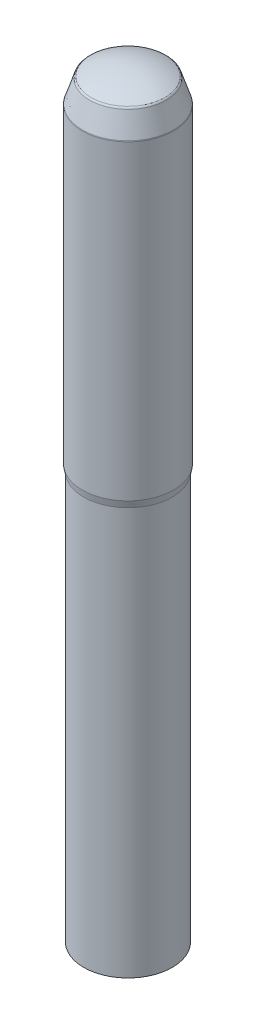
ISO-10303-21;
HEADER;
FILE_DESCRIPTION(('STEP AP214'),'2;1');
FILE_NAME('part.step','',(''),(''),'','','');
FILE_SCHEMA(('AUTOMOTIVE_DESIGN { 1 0 10303 214 1 1 1 1 }'));
ENDSEC;
DATA;
#1=APPLICATION_CONTEXT('core data for automotive mechanical design processes');
#2=APPLICATION_PROTOCOL_DEFINITION('international standard','automotive_design',2000,#1);
#3=PRODUCT_CONTEXT('',#1,'mechanical');
#4=PRODUCT('Part','Part','',(#3));
#5=PRODUCT_RELATED_PRODUCT_CATEGORY('part','',(#4));
#6=PRODUCT_DEFINITION_FORMATION('','',#4);
#7=PRODUCT_DEFINITION_CONTEXT('part definition',#1,'design');
#8=PRODUCT_DEFINITION('design','',#6,#7);
#9=PRODUCT_DEFINITION_SHAPE('','',#8);
#10=(LENGTH_UNIT() NAMED_UNIT(*) SI_UNIT(.MILLI.,.METRE.));
#11=(NAMED_UNIT(*) PLANE_ANGLE_UNIT() SI_UNIT($,.RADIAN.));
#12=(NAMED_UNIT(*) SI_UNIT($,.STERADIAN.) SOLID_ANGLE_UNIT());
#13=UNCERTAINTY_MEASURE_WITH_UNIT(LENGTH_MEASURE(1.E-05),#10,'distance_accuracy_value','');
#14=(GEOMETRIC_REPRESENTATION_CONTEXT(3) GLOBAL_UNCERTAINTY_ASSIGNED_CONTEXT((#13)) GLOBAL_UNIT_ASSIGNED_CONTEXT((#10,
#11,#12)) REPRESENTATION_CONTEXT('',''));
#15=CARTESIAN_POINT('',(0.,0.,0.));
#16=DIRECTION('',(0.,0.,1.));
#17=DIRECTION('',(1.,0.,0.));
#18=AXIS2_PLACEMENT_3D('',#15,#16,#17);
#19=CARTESIAN_POINT('',(0.,0.,0.));
#20=DIRECTION('',(0.,-1.,0.));
#21=DIRECTION('',(0.,0.,-1.));
#22=AXIS2_PLACEMENT_3D('',#19,#20,#21);
#23=PLANE('',#22);
#24=CARTESIAN_POINT('',(3.185,0.,0.));
#25=DIRECTION('',(0.,1.,0.));
#26=DIRECTION('',(0.,0.,1.));
#27=AXIS2_PLACEMENT_3D('',#24,#25,#26);
#28=CIRCLE('',#27,3.185);
#29=CARTESIAN_POINT('',(3.185,0.,3.185));
#30=VERTEX_POINT('',#29);
#31=EDGE_CURVE('E55',#30,#30,#28,.T.);
#32=ORIENTED_EDGE('',*,*,#31,.F.);
#33=EDGE_LOOP('',(#32));
#34=FACE_BOUND('',#33,.T.);
#35=ADVANCED_FACE('F30',(#34),#23,.T.);
#36=CARTESIAN_POINT('',(3.185,48.56,0.));
#37=DIRECTION('',(0.,1.,0.));
#38=DIRECTION('',(-1.,0.,0.));
#39=AXIS2_PLACEMENT_3D('',#36,#37,#38);
#40=SPHERICAL_SURFACE('',#39,6.);
#41=CARTESIAN_POINT('',(3.185,53.9403502477956,0.));
#42=DIRECTION('',(0.,1.,0.));
#43=DIRECTION('',(0.,0.,1.));
#44=AXIS2_PLACEMENT_3D('',#41,#42,#43);
#45=CIRCLE('',#44,2.65552842407037);
#46=CARTESIAN_POINT('',(3.185,53.9403502477956,2.65552842407037));
#47=VERTEX_POINT('',#46);
#48=EDGE_CURVE('E10',#47,#47,#45,.T.);
#49=ORIENTED_EDGE('',*,*,#48,.T.);
#50=EDGE_LOOP('',(#49));
#51=FACE_BOUND('',#50,.T.);
#52=ADVANCED_FACE('F63',(#51),#40,.T.);
#53=CARTESIAN_POINT('',(3.185,53.7610052395358,0.));
#54=DIRECTION('',(0.,1.,0.));
#55=DIRECTION('',(0.,0.,1.));
#56=AXIS2_PLACEMENT_3D('',#53,#54,#55);
#57=TOROIDAL_SURFACE('',#56,2.56701080993469,0.199999999999997);
#58=CARTESIAN_POINT('',(3.185,53.8228611517363,0.));
#59=DIRECTION('',(0.,1.,0.));
#60=DIRECTION('',(0.,0.,1.));
#61=AXIS2_PLACEMENT_3D('',#58,#59,#60);
#62=CIRCLE('',#61,2.75720504256501);
#63=CARTESIAN_POINT('',(3.185,53.8228611517363,2.75720504256501));
#64=VERTEX_POINT('',#63);
#65=EDGE_CURVE('E36',#64,#64,#62,.T.);
#66=ORIENTED_EDGE('',*,*,#65,.T.);
#67=EDGE_LOOP('',(#66));
#68=FACE_BOUND('',#67,.T.);
#69=ORIENTED_EDGE('',*,*,#48,.F.);
#70=EDGE_LOOP('',(#69));
#71=FACE_BOUND('',#70,.T.);
#72=ADVANCED_FACE('F67',(#68,#71),#57,.T.);
#73=CARTESIAN_POINT('',(3.185,53.8228611517363,0.));
#74=DIRECTION('',(0.,-1.,0.));
#75=DIRECTION('',(0.,0.,-1.));
#76=AXIS2_PLACEMENT_3D('',#73,#74,#75);
#77=CONICAL_SURFACE('',#76,2.75720504256501,0.314435356636743);
#78=CARTESIAN_POINT('',(3.185,52.2301507217965,0.));
#79=DIRECTION('',(0.,1.,0.));
#80=DIRECTION('',(0.,0.,1.));
#81=AXIS2_PLACEMENT_3D('',#78,#79,#80);
#82=CIRCLE('',#81,3.27519423263032);
#83=CARTESIAN_POINT('',(3.185,52.2301507217965,3.27519423263032));
#84=VERTEX_POINT('',#83);
#85=EDGE_CURVE('E40',#84,#84,#82,.T.);
#86=ORIENTED_EDGE('',*,*,#85,.T.);
#87=EDGE_LOOP('',(#86));
#88=FACE_BOUND('',#87,.T.);
#89=ORIENTED_EDGE('',*,*,#65,.F.);
#90=EDGE_LOOP('',(#89));
#91=FACE_BOUND('',#90,.T.);
#92=ADVANCED_FACE('F71',(#88,#91),#77,.T.);
#93=CARTESIAN_POINT('',(3.185,52.1682948095959,0.));
#94=DIRECTION('',(0.,1.,0.));
#95=DIRECTION('',(0.,0.,1.));
#96=AXIS2_PLACEMENT_3D('',#93,#94,#95);
#97=TOROIDAL_SURFACE('',#96,3.085,0.2);
#98=CARTESIAN_POINT('',(3.185,52.1682948095959,0.));
#99=DIRECTION('',(0.,1.,0.));
#100=DIRECTION('',(0.,0.,1.));
#101=AXIS2_PLACEMENT_3D('',#98,#99,#100);
#102=CIRCLE('',#101,3.285);
#103=CARTESIAN_POINT('',(3.185,52.1682948095959,3.285));
#104=VERTEX_POINT('',#103);
#105=EDGE_CURVE('E44',#104,#104,#102,.T.);
#106=ORIENTED_EDGE('',*,*,#105,.T.);
#107=EDGE_LOOP('',(#106));
#108=FACE_BOUND('',#107,.T.);
#109=ORIENTED_EDGE('',*,*,#85,.F.);
#110=EDGE_LOOP('',(#109));
#111=FACE_BOUND('',#110,.T.);
#112=ADVANCED_FACE('F76',(#108,#111),#97,.T.);
#113=CARTESIAN_POINT('',(3.185,54.56,0.));
#114=DIRECTION('',(0.,1.,0.));
#115=DIRECTION('',(0.,0.,1.));
#116=AXIS2_PLACEMENT_3D('',#113,#114,#115);
#117=CYLINDRICAL_SURFACE('',#116,3.285);
#118=CARTESIAN_POINT('',(3.185,29.8,0.));
#119=DIRECTION('',(0.,1.,0.));
#120=DIRECTION('',(0.,0.,1.));
#121=AXIS2_PLACEMENT_3D('',#118,#119,#120);
#122=CIRCLE('',#121,3.285);
#123=CARTESIAN_POINT('',(3.185,29.8,3.285));
#124=VERTEX_POINT('',#123);
#125=EDGE_CURVE('E49',#124,#124,#122,.T.);
#126=ORIENTED_EDGE('',*,*,#125,.T.);
#127=EDGE_LOOP('',(#126));
#128=FACE_BOUND('',#127,.T.);
#129=ORIENTED_EDGE('',*,*,#105,.F.);
#130=EDGE_LOOP('',(#129));
#131=FACE_BOUND('',#130,.T.);
#132=ADVANCED_FACE('F80',(#128,#131),#117,.T.);
#133=CARTESIAN_POINT('',(3.185,29.8,0.));
#134=DIRECTION('',(0.,1.,0.));
#135=DIRECTION('',(0.,0.,1.));
#136=AXIS2_PLACEMENT_3D('',#133,#134,#135);
#137=CONICAL_SURFACE('',#136,3.285,0.197395559849875);
#138=CARTESIAN_POINT('',(3.185,29.3,0.));
#139=DIRECTION('',(0.,1.,0.));
#140=DIRECTION('',(0.,0.,1.));
#141=AXIS2_PLACEMENT_3D('',#138,#139,#140);
#142=CIRCLE('',#141,3.185);
#143=CARTESIAN_POINT('',(3.185,29.3,3.185));
#144=VERTEX_POINT('',#143);
#145=EDGE_CURVE('E52',#144,#144,#142,.T.);
#146=ORIENTED_EDGE('',*,*,#145,.T.);
#147=EDGE_LOOP('',(#146));
#148=FACE_BOUND('',#147,.T.);
#149=ORIENTED_EDGE('',*,*,#125,.F.);
#150=EDGE_LOOP('',(#149));
#151=FACE_BOUND('',#150,.T.);
#152=ADVANCED_FACE('F84',(#148,#151),#137,.T.);
#153=CARTESIAN_POINT('',(3.185,54.56,0.));
#154=DIRECTION('',(0.,1.,0.));
#155=DIRECTION('',(0.,0.,1.));
#156=AXIS2_PLACEMENT_3D('',#153,#154,#155);
#157=CYLINDRICAL_SURFACE('',#156,3.185);
#158=ORIENTED_EDGE('',*,*,#31,.T.);
#159=EDGE_LOOP('',(#158));
#160=FACE_BOUND('',#159,.T.);
#161=ORIENTED_EDGE('',*,*,#145,.F.);
#162=EDGE_LOOP('',(#161));
#163=FACE_BOUND('',#162,.T.);
#164=ADVANCED_FACE('F59',(#160,#163),#157,.T.);
#165=CLOSED_SHELL('',(#35,#52,#72,#92,#112,#132,#152,#164));
#166=MANIFOLD_SOLID_BREP('B2',#165);
#167=ADVANCED_BREP_SHAPE_REPRESENTATION('',(#18,#166),#14);
#168=SHAPE_DEFINITION_REPRESENTATION(#9,#167);
ENDSEC;
END-ISO-10303-21;
